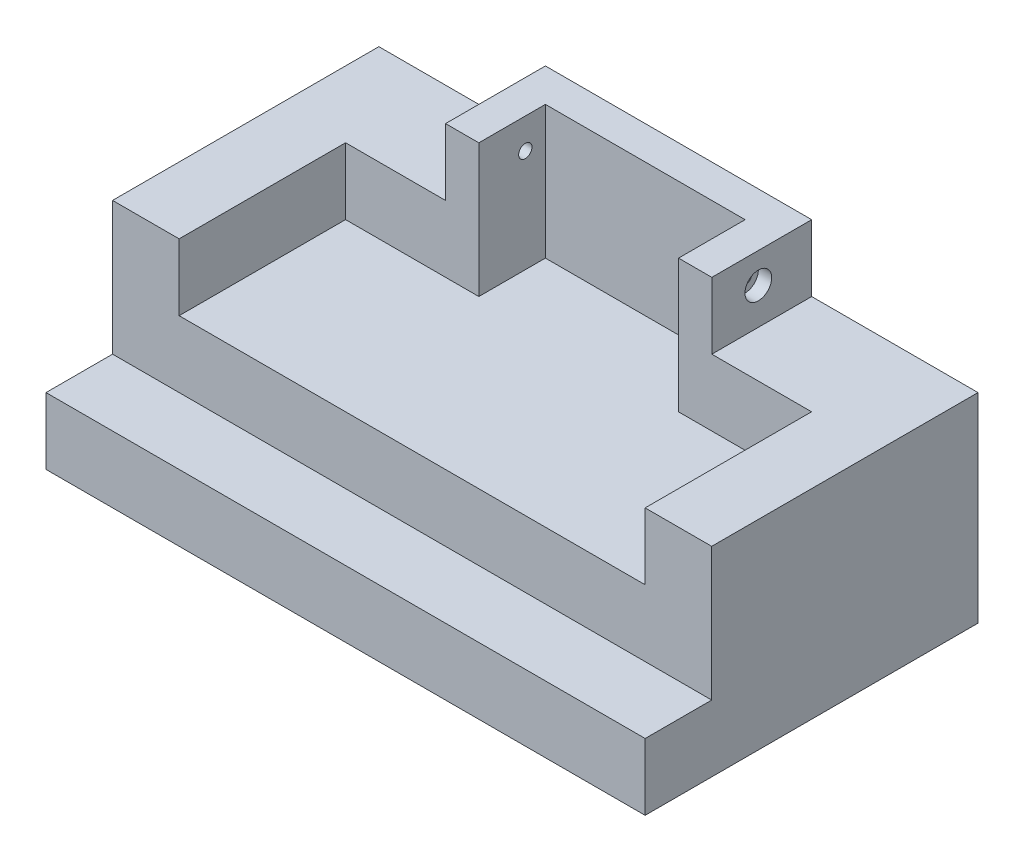
ISO-10303-21;
HEADER;
FILE_DESCRIPTION(('STEP AP214'),'2;1');
FILE_NAME('part.step','',(''),(''),'','','');
FILE_SCHEMA(('AUTOMOTIVE_DESIGN { 1 0 10303 214 1 1 1 1 }'));
ENDSEC;
DATA;
#1=APPLICATION_CONTEXT('core data for automotive mechanical design processes');
#2=APPLICATION_PROTOCOL_DEFINITION('international standard','automotive_design',2000,#1);
#3=PRODUCT_CONTEXT('',#1,'mechanical');
#4=PRODUCT('Part','Part','',(#3));
#5=PRODUCT_RELATED_PRODUCT_CATEGORY('part','',(#4));
#6=PRODUCT_DEFINITION_FORMATION('','',#4);
#7=PRODUCT_DEFINITION_CONTEXT('part definition',#1,'design');
#8=PRODUCT_DEFINITION('design','',#6,#7);
#9=PRODUCT_DEFINITION_SHAPE('','',#8);
#10=(LENGTH_UNIT() NAMED_UNIT(*) SI_UNIT(.MILLI.,.METRE.));
#11=(NAMED_UNIT(*) PLANE_ANGLE_UNIT() SI_UNIT($,.RADIAN.));
#12=(NAMED_UNIT(*) SI_UNIT($,.STERADIAN.) SOLID_ANGLE_UNIT());
#13=UNCERTAINTY_MEASURE_WITH_UNIT(LENGTH_MEASURE(1.E-05),#10,'distance_accuracy_value','');
#14=(GEOMETRIC_REPRESENTATION_CONTEXT(3) GLOBAL_UNCERTAINTY_ASSIGNED_CONTEXT((#13)) GLOBAL_UNIT_ASSIGNED_CONTEXT((#10,
#11,#12)) REPRESENTATION_CONTEXT('',''));
#15=CARTESIAN_POINT('',(0.,0.,0.));
#16=DIRECTION('',(0.,0.,1.));
#17=DIRECTION('',(1.,0.,0.));
#18=AXIS2_PLACEMENT_3D('',#15,#16,#17);
#19=CARTESIAN_POINT('',(1.25087486127139,1.5,0.));
#20=DIRECTION('',(-1.,0.,0.));
#21=DIRECTION('',(0.,0.,1.));
#22=AXIS2_PLACEMENT_3D('',#19,#20,#21);
#23=PLANE('',#22);
#24=DIRECTION('',(0.,0.,1.));
#25=VECTOR('',#24,1.);
#26=CARTESIAN_POINT('',(1.25087486127139,2.,0.));
#27=LINE('',#26,#25);
#28=CARTESIAN_POINT('',(1.25087486127139,2.,-2.5));
#29=VERTEX_POINT('',#28);
#30=CARTESIAN_POINT('',(1.25087486127139,2.,-1.75));
#31=VERTEX_POINT('',#30);
#32=EDGE_CURVE('E260',#29,#31,#27,.T.);
#33=ORIENTED_EDGE('',*,*,#32,.F.);
#34=DIRECTION('',(0.,1.,0.));
#35=VECTOR('',#34,1.);
#36=CARTESIAN_POINT('',(1.25087486127139,1.5,-2.5));
#37=LINE('',#36,#35);
#38=CARTESIAN_POINT('',(1.25087486127139,1.5,-2.5));
#39=VERTEX_POINT('',#38);
#40=EDGE_CURVE('E280',#39,#29,#37,.T.);
#41=ORIENTED_EDGE('',*,*,#40,.F.);
#42=DIRECTION('',(0.,0.,1.));
#43=VECTOR('',#42,1.);
#44=CARTESIAN_POINT('',(1.25087486127139,1.5,0.));
#45=LINE('',#44,#43);
#46=CARTESIAN_POINT('',(1.25087486127139,1.5,-1.75));
#47=VERTEX_POINT('',#46);
#48=EDGE_CURVE('E238',#39,#47,#45,.T.);
#49=ORIENTED_EDGE('',*,*,#48,.T.);
#50=DIRECTION('',(0.,1.,0.));
#51=VECTOR('',#50,1.);
#52=CARTESIAN_POINT('',(1.25087486127139,1.5,-1.75));
#53=LINE('',#52,#51);
#54=EDGE_CURVE('E283',#47,#31,#53,.T.);
#55=ORIENTED_EDGE('',*,*,#54,.T.);
#56=EDGE_LOOP('',(#33,#41,#49,#55));
#57=FACE_BOUND('',#56,.T.);
#58=CARTESIAN_POINT('',(1.25087486127139,1.77279252722854,-2.0992621020998));
#59=DIRECTION('',(-1.,0.,0.));
#60=DIRECTION('',(0.,0.,1.));
#61=AXIS2_PLACEMENT_3D('',#58,#59,#60);
#62=CIRCLE('',#61,0.0499999999999996);
#63=CARTESIAN_POINT('',(1.25087486127139,1.77279252722854,-2.0492621020998));
#64=VERTEX_POINT('',#63);
#65=EDGE_CURVE('E357',#64,#64,#62,.F.);
#66=ORIENTED_EDGE('',*,*,#65,.T.);
#67=EDGE_LOOP('',(#66));
#68=FACE_BOUND('',#67,.T.);
#69=ADVANCED_FACE('F42',(#57,#68),#23,.T.);
#70=CARTESIAN_POINT('',(0.,1.5,0.));
#71=DIRECTION('',(0.,1.,0.));
#72=DIRECTION('',(0.,0.,1.));
#73=AXIS2_PLACEMENT_3D('',#70,#71,#72);
#74=PLANE('',#73);
#75=DIRECTION('',(-1.,0.,0.));
#76=VECTOR('',#75,1.);
#77=CARTESIAN_POINT('',(0.5,1.5,-0.499892288813847));
#78=LINE('',#77,#76);
#79=CARTESIAN_POINT('',(4.5,1.5,-0.499892288813847));
#80=VERTEX_POINT('',#79);
#81=CARTESIAN_POINT('',(4.,1.5,-0.499892288813847));
#82=VERTEX_POINT('',#81);
#83=EDGE_CURVE('E178',#80,#82,#78,.T.);
#84=ORIENTED_EDGE('',*,*,#83,.F.);
#85=DIRECTION('',(0.,0.,-1.));
#86=VECTOR('',#85,1.);
#87=CARTESIAN_POINT('',(4.5,1.5,0.));
#88=LINE('',#87,#86);
#89=CARTESIAN_POINT('',(4.5,1.5,-2.5));
#90=VERTEX_POINT('',#89);
#91=EDGE_CURVE('E247',#80,#90,#88,.T.);
#92=ORIENTED_EDGE('',*,*,#91,.T.);
#93=DIRECTION('',(-1.,0.,0.));
#94=VECTOR('',#93,1.);
#95=CARTESIAN_POINT('',(0.,1.5,-2.5));
#96=LINE('',#95,#94);
#97=CARTESIAN_POINT('',(3.25087486127139,1.5,-2.5));
#98=VERTEX_POINT('',#97);
#99=EDGE_CURVE('E245',#90,#98,#96,.T.);
#100=ORIENTED_EDGE('',*,*,#99,.T.);
#101=DIRECTION('',(0.,0.,1.));
#102=VECTOR('',#101,1.);
#103=CARTESIAN_POINT('',(3.25087486127139,1.5,0.));
#104=LINE('',#103,#102);
#105=CARTESIAN_POINT('',(3.25087486127139,1.5,-1.75));
#106=VERTEX_POINT('',#105);
#107=EDGE_CURVE('E249',#98,#106,#104,.T.);
#108=ORIENTED_EDGE('',*,*,#107,.T.);
#109=DIRECTION('',(1.,0.,0.));
#110=VECTOR('',#109,1.);
#111=CARTESIAN_POINT('',(0.,1.5,-1.75));
#112=LINE('',#111,#110);
#113=CARTESIAN_POINT('',(4.,1.5,-1.75));
#114=VERTEX_POINT('',#113);
#115=EDGE_CURVE('E11',#106,#114,#112,.T.);
#116=ORIENTED_EDGE('',*,*,#115,.T.);
#117=DIRECTION('',(0.,0.,1.));
#118=VECTOR('',#117,1.);
#119=CARTESIAN_POINT('',(4.,1.5,0.));
#120=LINE('',#119,#118);
#121=EDGE_CURVE('E204',#114,#82,#120,.T.);
#122=ORIENTED_EDGE('',*,*,#121,.T.);
#123=EDGE_LOOP('',(#84,#92,#100,#108,#116,#122));
#124=FACE_BOUND('',#123,.T.);
#125=ADVANCED_FACE('F330',(#124),#74,.T.);
#126=CARTESIAN_POINT('',(0.,2.,0.));
#127=DIRECTION('',(0.,0.,-1.));
#128=DIRECTION('',(-1.,0.,0.));
#129=AXIS2_PLACEMENT_3D('',#126,#127,#128);
#130=PLANE('',#129);
#131=DIRECTION('',(1.,0.,0.));
#132=VECTOR('',#131,1.);
#133=CARTESIAN_POINT('',(0.,0.5,0.));
#134=LINE('',#133,#132);
#135=CARTESIAN_POINT('',(0.,0.5,0.));
#136=VERTEX_POINT('',#135);
#137=CARTESIAN_POINT('',(4.5,0.5,0.));
#138=VERTEX_POINT('',#137);
#139=EDGE_CURVE('E192',#136,#138,#134,.T.);
#140=ORIENTED_EDGE('',*,*,#139,.F.);
#141=DIRECTION('',(0.,-1.,0.));
#142=VECTOR('',#141,1.);
#143=CARTESIAN_POINT('',(0.,2.,0.));
#144=LINE('',#143,#142);
#145=CARTESIAN_POINT('',(0.,0.,0.));
#146=VERTEX_POINT('',#145);
#147=EDGE_CURVE('E51',#136,#146,#144,.T.);
#148=ORIENTED_EDGE('',*,*,#147,.T.);
#149=DIRECTION('',(1.,0.,0.));
#150=VECTOR('',#149,1.);
#151=CARTESIAN_POINT('',(0.,0.,0.));
#152=LINE('',#151,#150);
#153=CARTESIAN_POINT('',(4.5,0.,0.));
#154=VERTEX_POINT('',#153);
#155=EDGE_CURVE('E294',#146,#154,#152,.T.);
#156=ORIENTED_EDGE('',*,*,#155,.T.);
#157=DIRECTION('',(0.,-1.,0.));
#158=VECTOR('',#157,1.);
#159=CARTESIAN_POINT('',(4.5,2.,0.));
#160=LINE('',#159,#158);
#161=EDGE_CURVE('E305',#138,#154,#160,.T.);
#162=ORIENTED_EDGE('',*,*,#161,.F.);
#163=EDGE_LOOP('',(#140,#148,#156,#162));
#164=FACE_BOUND('',#163,.T.);
#165=ADVANCED_FACE('F309',(#164),#130,.F.);
#166=CARTESIAN_POINT('',(0.5,1.5,-0.499892288813847));
#167=VERTEX_POINT('',#166);
#168=CARTESIAN_POINT('',(0.,1.5,-0.499892288813847));
#169=VERTEX_POINT('',#168);
#170=EDGE_CURVE('E184',#167,#169,#78,.T.);
#171=ORIENTED_EDGE('',*,*,#170,.F.);
#172=DIRECTION('',(0.,0.,1.));
#173=VECTOR('',#172,1.);
#174=CARTESIAN_POINT('',(0.5,1.5,0.));
#175=LINE('',#174,#173);
#176=CARTESIAN_POINT('',(0.5,1.5,-1.75));
#177=VERTEX_POINT('',#176);
#178=EDGE_CURVE('E225',#177,#167,#175,.T.);
#179=ORIENTED_EDGE('',*,*,#178,.F.);
#180=DIRECTION('',(1.,0.,0.));
#181=VECTOR('',#180,1.);
#182=CARTESIAN_POINT('',(0.,1.5,-1.75));
#183=LINE('',#182,#181);
#184=EDGE_CURVE('E58',#177,#47,#183,.T.);
#185=ORIENTED_EDGE('',*,*,#184,.T.);
#186=ORIENTED_EDGE('',*,*,#48,.F.);
#187=CARTESIAN_POINT('',(0.,1.5,-2.5));
#188=VERTEX_POINT('',#187);
#189=EDGE_CURVE('E241',#39,#188,#96,.T.);
#190=ORIENTED_EDGE('',*,*,#189,.T.);
#191=DIRECTION('',(0.,0.,1.));
#192=VECTOR('',#191,1.);
#193=CARTESIAN_POINT('',(0.,1.5,0.));
#194=LINE('',#193,#192);
#195=EDGE_CURVE('E244',#188,#169,#194,.T.);
#196=ORIENTED_EDGE('',*,*,#195,.T.);
#197=EDGE_LOOP('',(#171,#179,#185,#186,#190,#196));
#198=FACE_BOUND('',#197,.T.);
#199=ADVANCED_FACE('F348',(#198),#74,.T.);
#200=CARTESIAN_POINT('',(0.,2.,0.));
#201=DIRECTION('',(1.,0.,0.));
#202=DIRECTION('',(0.,0.,-1.));
#203=AXIS2_PLACEMENT_3D('',#200,#201,#202);
#204=PLANE('',#203);
#205=DIRECTION('',(0.,0.,1.));
#206=VECTOR('',#205,1.);
#207=CARTESIAN_POINT('',(0.,0.5,-0.499892288813847));
#208=LINE('',#207,#206);
#209=CARTESIAN_POINT('',(0.,0.5,-0.499892288813847));
#210=VERTEX_POINT('',#209);
#211=EDGE_CURVE('E172',#210,#136,#208,.T.);
#212=ORIENTED_EDGE('',*,*,#211,.F.);
#213=DIRECTION('',(0.,1.,0.));
#214=VECTOR('',#213,1.);
#215=CARTESIAN_POINT('',(0.,0.5,-0.499892288813847));
#216=LINE('',#215,#214);
#217=EDGE_CURVE('E181',#210,#169,#216,.T.);
#218=ORIENTED_EDGE('',*,*,#217,.T.);
#219=ORIENTED_EDGE('',*,*,#195,.F.);
#220=DIRECTION('',(0.,-1.,0.));
#221=VECTOR('',#220,1.);
#222=CARTESIAN_POINT('',(0.,2.,-2.5));
#223=LINE('',#222,#221);
#224=CARTESIAN_POINT('',(0.,0.,-2.5));
#225=VERTEX_POINT('',#224);
#226=EDGE_CURVE('E291',#188,#225,#223,.T.);
#227=ORIENTED_EDGE('',*,*,#226,.T.);
#228=DIRECTION('',(0.,0.,1.));
#229=VECTOR('',#228,1.);
#230=CARTESIAN_POINT('',(0.,0.,0.));
#231=LINE('',#230,#229);
#232=EDGE_CURVE('E273',#225,#146,#231,.T.);
#233=ORIENTED_EDGE('',*,*,#232,.T.);
#234=ORIENTED_EDGE('',*,*,#147,.F.);
#235=EDGE_LOOP('',(#212,#218,#219,#227,#233,#234));
#236=FACE_BOUND('',#235,.T.);
#237=ADVANCED_FACE('F44',(#236),#204,.F.);
#238=CARTESIAN_POINT('',(4.5,2.,0.));
#239=DIRECTION('',(-1.,0.,0.));
#240=DIRECTION('',(0.,0.,1.));
#241=AXIS2_PLACEMENT_3D('',#238,#239,#240);
#242=PLANE('',#241);
#243=ORIENTED_EDGE('',*,*,#91,.F.);
#244=DIRECTION('',(0.,1.,0.));
#245=VECTOR('',#244,1.);
#246=CARTESIAN_POINT('',(4.5,0.5,-0.499892288813847));
#247=LINE('',#246,#245);
#248=CARTESIAN_POINT('',(4.5,0.5,-0.499892288813847));
#249=VERTEX_POINT('',#248);
#250=EDGE_CURVE('E188',#249,#80,#247,.T.);
#251=ORIENTED_EDGE('',*,*,#250,.F.);
#252=DIRECTION('',(0.,0.,-1.));
#253=VECTOR('',#252,1.);
#254=CARTESIAN_POINT('',(4.5,0.5,0.));
#255=LINE('',#254,#253);
#256=EDGE_CURVE('E175',#138,#249,#255,.T.);
#257=ORIENTED_EDGE('',*,*,#256,.F.);
#258=ORIENTED_EDGE('',*,*,#161,.T.);
#259=DIRECTION('',(0.,0.,-1.));
#260=VECTOR('',#259,1.);
#261=CARTESIAN_POINT('',(4.5,0.,0.));
#262=LINE('',#261,#260);
#263=CARTESIAN_POINT('',(4.5,0.,-2.5));
#264=VERTEX_POINT('',#263);
#265=EDGE_CURVE('E297',#154,#264,#262,.T.);
#266=ORIENTED_EDGE('',*,*,#265,.T.);
#267=DIRECTION('',(0.,-1.,0.));
#268=VECTOR('',#267,1.);
#269=CARTESIAN_POINT('',(4.5,2.,-2.5));
#270=LINE('',#269,#268);
#271=EDGE_CURVE('E303',#90,#264,#270,.T.);
#272=ORIENTED_EDGE('',*,*,#271,.F.);
#273=EDGE_LOOP('',(#243,#251,#257,#258,#266,#272));
#274=FACE_BOUND('',#273,.T.);
#275=ADVANCED_FACE('F327',(#274),#242,.F.);
#276=CARTESIAN_POINT('',(0.,2.,-2.5));
#277=DIRECTION('',(0.,0.,1.));
#278=DIRECTION('',(1.,0.,0.));
#279=AXIS2_PLACEMENT_3D('',#276,#277,#278);
#280=PLANE('',#279);
#281=DIRECTION('',(-1.,0.,0.));
#282=VECTOR('',#281,1.);
#283=CARTESIAN_POINT('',(0.,2.,-2.5));
#284=LINE('',#283,#282);
#285=CARTESIAN_POINT('',(3.25087486127139,2.,-2.5));
#286=VERTEX_POINT('',#285);
#287=EDGE_CURVE('E288',#286,#29,#284,.T.);
#288=ORIENTED_EDGE('',*,*,#287,.F.);
#289=DIRECTION('',(0.,1.,0.));
#290=VECTOR('',#289,1.);
#291=CARTESIAN_POINT('',(3.25087486127139,1.5,-2.5));
#292=LINE('',#291,#290);
#293=EDGE_CURVE('E278',#98,#286,#292,.T.);
#294=ORIENTED_EDGE('',*,*,#293,.F.);
#295=ORIENTED_EDGE('',*,*,#99,.F.);
#296=ORIENTED_EDGE('',*,*,#271,.T.);
#297=DIRECTION('',(-1.,0.,0.));
#298=VECTOR('',#297,1.);
#299=CARTESIAN_POINT('',(0.,0.,-2.5));
#300=LINE('',#299,#298);
#301=EDGE_CURVE('E292',#264,#225,#300,.T.);
#302=ORIENTED_EDGE('',*,*,#301,.T.);
#303=ORIENTED_EDGE('',*,*,#226,.F.);
#304=ORIENTED_EDGE('',*,*,#189,.F.);
#305=ORIENTED_EDGE('',*,*,#40,.T.);
#306=EDGE_LOOP('',(#288,#294,#295,#296,#302,#303,#304,#305));
#307=FACE_BOUND('',#306,.T.);
#308=ADVANCED_FACE('F320',(#307),#280,.F.);
#309=CARTESIAN_POINT('',(0.,2.,0.));
#310=DIRECTION('',(0.,-1.,0.));
#311=DIRECTION('',(0.,0.,-1.));
#312=AXIS2_PLACEMENT_3D('',#309,#310,#311);
#313=PLANE('',#312);
#314=DIRECTION('',(1.,0.,0.));
#315=VECTOR('',#314,1.);
#316=CARTESIAN_POINT('',(0.,2.,-1.75000000000001));
#317=LINE('',#316,#315);
#318=CARTESIAN_POINT('',(3.00087486127139,2.,-1.75));
#319=VERTEX_POINT('',#318);
#320=CARTESIAN_POINT('',(3.25087486127139,2.,-1.75));
#321=VERTEX_POINT('',#320);
#322=EDGE_CURVE('E266',#319,#321,#317,.T.);
#323=ORIENTED_EDGE('',*,*,#322,.T.);
#324=DIRECTION('',(0.,0.,1.));
#325=VECTOR('',#324,1.);
#326=CARTESIAN_POINT('',(3.25087486127139,2.,0.));
#327=LINE('',#326,#325);
#328=EDGE_CURVE('E263',#286,#321,#327,.T.);
#329=ORIENTED_EDGE('',*,*,#328,.F.);
#330=ORIENTED_EDGE('',*,*,#287,.T.);
#331=ORIENTED_EDGE('',*,*,#32,.T.);
#332=DIRECTION('',(1.,0.,0.));
#333=VECTOR('',#332,1.);
#334=CARTESIAN_POINT('',(0.,2.,-1.75));
#335=LINE('',#334,#333);
#336=CARTESIAN_POINT('',(1.50087486127139,2.,-1.75));
#337=VERTEX_POINT('',#336);
#338=EDGE_CURVE('E257',#31,#337,#335,.T.);
#339=ORIENTED_EDGE('',*,*,#338,.T.);
#340=DIRECTION('',(0.,0.,1.));
#341=VECTOR('',#340,1.);
#342=CARTESIAN_POINT('',(1.50087486127139,2.,0.));
#343=LINE('',#342,#341);
#344=CARTESIAN_POINT('',(1.50087486127139,2.,-2.25));
#345=VERTEX_POINT('',#344);
#346=EDGE_CURVE('E254',#345,#337,#343,.T.);
#347=ORIENTED_EDGE('',*,*,#346,.F.);
#348=DIRECTION('',(1.,0.,0.));
#349=VECTOR('',#348,1.);
#350=CARTESIAN_POINT('',(0.,2.,-2.25));
#351=LINE('',#350,#349);
#352=CARTESIAN_POINT('',(3.00087486127139,2.,-2.25));
#353=VERTEX_POINT('',#352);
#354=EDGE_CURVE('E66',#345,#353,#351,.T.);
#355=ORIENTED_EDGE('',*,*,#354,.T.);
#356=DIRECTION('',(0.,0.,1.));
#357=VECTOR('',#356,1.);
#358=CARTESIAN_POINT('',(3.00087486127139,2.,0.));
#359=LINE('',#358,#357);
#360=EDGE_CURVE('E242',#353,#319,#359,.T.);
#361=ORIENTED_EDGE('',*,*,#360,.T.);
#362=EDGE_LOOP('',(#323,#329,#330,#331,#339,#347,#355,#361));
#363=FACE_BOUND('',#362,.T.);
#364=ADVANCED_FACE('F392',(#363),#313,.F.);
#365=CARTESIAN_POINT('',(0.,0.,0.));
#366=DIRECTION('',(0.,-1.,0.));
#367=DIRECTION('',(0.,0.,-1.));
#368=AXIS2_PLACEMENT_3D('',#365,#366,#367);
#369=PLANE('',#368);
#370=ORIENTED_EDGE('',*,*,#232,.F.);
#371=ORIENTED_EDGE('',*,*,#301,.F.);
#372=ORIENTED_EDGE('',*,*,#265,.F.);
#373=ORIENTED_EDGE('',*,*,#155,.F.);
#374=EDGE_LOOP('',(#370,#371,#372,#373));
#375=FACE_BOUND('',#374,.T.);
#376=ADVANCED_FACE('F314',(#375),#369,.T.);
#377=CARTESIAN_POINT('',(0.,1.5,-2.25));
#378=DIRECTION('',(0.,0.,1.));
#379=DIRECTION('',(1.,0.,0.));
#380=AXIS2_PLACEMENT_3D('',#377,#378,#379);
#381=PLANE('',#380);
#382=ORIENTED_EDGE('',*,*,#354,.F.);
#383=DIRECTION('',(0.,1.,0.));
#384=VECTOR('',#383,1.);
#385=CARTESIAN_POINT('',(1.50087486127139,1.5,-2.25));
#386=LINE('',#385,#384);
#387=CARTESIAN_POINT('',(1.50087486127139,1.,-2.25));
#388=VERTEX_POINT('',#387);
#389=EDGE_CURVE('E252',#388,#345,#386,.T.);
#390=ORIENTED_EDGE('',*,*,#389,.F.);
#391=DIRECTION('',(-1.,0.,0.));
#392=VECTOR('',#391,1.);
#393=CARTESIAN_POINT('',(0.,1.,-2.25));
#394=LINE('',#393,#392);
#395=CARTESIAN_POINT('',(3.00087486127139,1.,-2.25));
#396=VERTEX_POINT('',#395);
#397=EDGE_CURVE('E217',#396,#388,#394,.T.);
#398=ORIENTED_EDGE('',*,*,#397,.F.);
#399=DIRECTION('',(0.,1.,0.));
#400=VECTOR('',#399,1.);
#401=CARTESIAN_POINT('',(3.00087486127139,1.5,-2.25));
#402=LINE('',#401,#400);
#403=EDGE_CURVE('E271',#396,#353,#402,.T.);
#404=ORIENTED_EDGE('',*,*,#403,.T.);
#405=EDGE_LOOP('',(#382,#390,#398,#404));
#406=FACE_BOUND('',#405,.T.);
#407=ADVANCED_FACE('F399',(#406),#381,.T.);
#408=CARTESIAN_POINT('',(3.00087486127139,1.5,0.));
#409=DIRECTION('',(-1.,0.,0.));
#410=DIRECTION('',(0.,0.,1.));
#411=AXIS2_PLACEMENT_3D('',#408,#409,#410);
#412=PLANE('',#411);
#413=CARTESIAN_POINT('',(3.00087486127139,1.77279252722854,-2.0992621020998));
#414=DIRECTION('',(-1.,0.,0.));
#415=DIRECTION('',(0.,0.,1.));
#416=AXIS2_PLACEMENT_3D('',#413,#414,#415);
#417=CIRCLE('',#416,0.0499999999999996);
#418=CARTESIAN_POINT('',(3.00087486127139,1.77279252722854,-2.0492621020998));
#419=VERTEX_POINT('',#418);
#420=EDGE_CURVE('E350',#419,#419,#417,.T.);
#421=ORIENTED_EDGE('',*,*,#420,.F.);
#422=EDGE_LOOP('',(#421));
#423=FACE_BOUND('',#422,.T.);
#424=ORIENTED_EDGE('',*,*,#360,.F.);
#425=ORIENTED_EDGE('',*,*,#403,.F.);
#426=DIRECTION('',(0.,0.,-1.));
#427=VECTOR('',#426,1.);
#428=CARTESIAN_POINT('',(3.00087486127139,1.,0.));
#429=LINE('',#428,#427);
#430=CARTESIAN_POINT('',(3.00087486127139,1.,-1.75));
#431=VERTEX_POINT('',#430);
#432=EDGE_CURVE('E214',#431,#396,#429,.T.);
#433=ORIENTED_EDGE('',*,*,#432,.F.);
#434=DIRECTION('',(0.,1.,0.));
#435=VECTOR('',#434,1.);
#436=CARTESIAN_POINT('',(3.00087486127139,1.5,-1.75));
#437=LINE('',#436,#435);
#438=EDGE_CURVE('E274',#431,#319,#437,.T.);
#439=ORIENTED_EDGE('',*,*,#438,.T.);
#440=EDGE_LOOP('',(#424,#425,#433,#439));
#441=FACE_BOUND('',#440,.T.);
#442=ADVANCED_FACE('F397',(#423,#441),#412,.T.);
#443=CARTESIAN_POINT('',(0.,1.5,-1.75000000000001));
#444=DIRECTION('',(0.,0.,1.));
#445=DIRECTION('',(1.,0.,0.));
#446=AXIS2_PLACEMENT_3D('',#443,#444,#445);
#447=PLANE('',#446);
#448=ORIENTED_EDGE('',*,*,#322,.F.);
#449=ORIENTED_EDGE('',*,*,#438,.F.);
#450=DIRECTION('',(1.,0.,0.));
#451=VECTOR('',#450,1.);
#452=CARTESIAN_POINT('',(0.,1.,-1.75));
#453=LINE('',#452,#451);
#454=CARTESIAN_POINT('',(4.,1.,-1.75));
#455=VERTEX_POINT('',#454);
#456=EDGE_CURVE('E205',#431,#455,#453,.T.);
#457=ORIENTED_EDGE('',*,*,#456,.T.);
#458=DIRECTION('',(0.,1.,0.));
#459=VECTOR('',#458,1.);
#460=CARTESIAN_POINT('',(4.,1.,-1.75));
#461=LINE('',#460,#459);
#462=EDGE_CURVE('E230',#455,#114,#461,.T.);
#463=ORIENTED_EDGE('',*,*,#462,.T.);
#464=ORIENTED_EDGE('',*,*,#115,.F.);
#465=DIRECTION('',(0.,1.,0.));
#466=VECTOR('',#465,1.);
#467=CARTESIAN_POINT('',(3.25087486127139,1.5,-1.75));
#468=LINE('',#467,#466);
#469=EDGE_CURVE('E276',#106,#321,#468,.T.);
#470=ORIENTED_EDGE('',*,*,#469,.T.);
#471=EDGE_LOOP('',(#448,#449,#457,#463,#464,#470));
#472=FACE_BOUND('',#471,.T.);
#473=ADVANCED_FACE('F386',(#472),#447,.T.);
#474=CARTESIAN_POINT('',(3.25087486127139,1.5,0.));
#475=DIRECTION('',(-1.,0.,0.));
#476=DIRECTION('',(0.,0.,1.));
#477=AXIS2_PLACEMENT_3D('',#474,#475,#476);
#478=PLANE('',#477);
#479=CARTESIAN_POINT('',(3.25087486127139,1.77279252722854,-2.0992621020998));
#480=DIRECTION('',(1.,0.,0.));
#481=DIRECTION('',(0.,0.,-1.));
#482=AXIS2_PLACEMENT_3D('',#479,#480,#481);
#483=CIRCLE('',#482,0.1);
#484=CARTESIAN_POINT('',(3.25087486127139,1.77279252722854,-2.1992621020998));
#485=VERTEX_POINT('',#484);
#486=EDGE_CURVE('E361',#485,#485,#483,.T.);
#487=ORIENTED_EDGE('',*,*,#486,.F.);
#488=EDGE_LOOP('',(#487));
#489=FACE_BOUND('',#488,.T.);
#490=ORIENTED_EDGE('',*,*,#328,.T.);
#491=ORIENTED_EDGE('',*,*,#469,.F.);
#492=ORIENTED_EDGE('',*,*,#107,.F.);
#493=ORIENTED_EDGE('',*,*,#293,.T.);
#494=EDGE_LOOP('',(#490,#491,#492,#493));
#495=FACE_BOUND('',#494,.T.);
#496=ADVANCED_FACE('F383',(#489,#495),#478,.F.);
#497=CARTESIAN_POINT('',(0.,1.5,-1.75));
#498=DIRECTION('',(0.,0.,1.));
#499=DIRECTION('',(1.,0.,0.));
#500=AXIS2_PLACEMENT_3D('',#497,#498,#499);
#501=PLANE('',#500);
#502=ORIENTED_EDGE('',*,*,#338,.F.);
#503=ORIENTED_EDGE('',*,*,#54,.F.);
#504=ORIENTED_EDGE('',*,*,#184,.F.);
#505=DIRECTION('',(0.,1.,0.));
#506=VECTOR('',#505,1.);
#507=CARTESIAN_POINT('',(0.5,1.,-1.75));
#508=LINE('',#507,#506);
#509=CARTESIAN_POINT('',(0.5,1.,-1.75));
#510=VERTEX_POINT('',#509);
#511=EDGE_CURVE('E223',#510,#177,#508,.T.);
#512=ORIENTED_EDGE('',*,*,#511,.F.);
#513=CARTESIAN_POINT('',(1.50087486127139,1.,-1.75));
#514=VERTEX_POINT('',#513);
#515=EDGE_CURVE('E200',#510,#514,#453,.T.);
#516=ORIENTED_EDGE('',*,*,#515,.T.);
#517=DIRECTION('',(0.,1.,0.));
#518=VECTOR('',#517,1.);
#519=CARTESIAN_POINT('',(1.50087486127139,1.5,-1.75));
#520=LINE('',#519,#518);
#521=EDGE_CURVE('E285',#514,#337,#520,.T.);
#522=ORIENTED_EDGE('',*,*,#521,.T.);
#523=EDGE_LOOP('',(#502,#503,#504,#512,#516,#522));
#524=FACE_BOUND('',#523,.T.);
#525=ADVANCED_FACE('F346',(#524),#501,.T.);
#526=CARTESIAN_POINT('',(1.50087486127139,1.5,0.));
#527=DIRECTION('',(-1.,0.,0.));
#528=DIRECTION('',(0.,0.,1.));
#529=AXIS2_PLACEMENT_3D('',#526,#527,#528);
#530=PLANE('',#529);
#531=CARTESIAN_POINT('',(1.50087486127139,1.77279252722854,-2.0992621020998));
#532=DIRECTION('',(-1.,0.,0.));
#533=DIRECTION('',(0.,0.,1.));
#534=AXIS2_PLACEMENT_3D('',#531,#532,#533);
#535=CIRCLE('',#534,0.0499999999999996);
#536=CARTESIAN_POINT('',(1.50087486127139,1.77279252722854,-2.0492621020998));
#537=VERTEX_POINT('',#536);
#538=EDGE_CURVE('E46',#537,#537,#535,.T.);
#539=ORIENTED_EDGE('',*,*,#538,.T.);
#540=EDGE_LOOP('',(#539));
#541=FACE_BOUND('',#540,.T.);
#542=ORIENTED_EDGE('',*,*,#346,.T.);
#543=ORIENTED_EDGE('',*,*,#521,.F.);
#544=DIRECTION('',(0.,0.,1.));
#545=VECTOR('',#544,1.);
#546=CARTESIAN_POINT('',(1.50087486127139,1.,0.));
#547=LINE('',#546,#545);
#548=EDGE_CURVE('E220',#388,#514,#547,.T.);
#549=ORIENTED_EDGE('',*,*,#548,.F.);
#550=ORIENTED_EDGE('',*,*,#389,.T.);
#551=EDGE_LOOP('',(#542,#543,#549,#550));
#552=FACE_BOUND('',#551,.T.);
#553=ADVANCED_FACE('F401',(#541,#552),#530,.F.);
#554=CARTESIAN_POINT('',(4.,1.,0.));
#555=DIRECTION('',(-1.,0.,0.));
#556=DIRECTION('',(0.,0.,1.));
#557=AXIS2_PLACEMENT_3D('',#554,#555,#556);
#558=PLANE('',#557);
#559=ORIENTED_EDGE('',*,*,#121,.F.);
#560=ORIENTED_EDGE('',*,*,#462,.F.);
#561=DIRECTION('',(0.,0.,1.));
#562=VECTOR('',#561,1.);
#563=CARTESIAN_POINT('',(4.,1.,0.));
#564=LINE('',#563,#562);
#565=CARTESIAN_POINT('',(4.,1.,-0.499892288813847));
#566=VERTEX_POINT('',#565);
#567=EDGE_CURVE('E211',#455,#566,#564,.T.);
#568=ORIENTED_EDGE('',*,*,#567,.T.);
#569=DIRECTION('',(0.,1.,0.));
#570=VECTOR('',#569,1.);
#571=CARTESIAN_POINT('',(4.,1.,-0.499892288813847));
#572=LINE('',#571,#570);
#573=EDGE_CURVE('E232',#566,#82,#572,.T.);
#574=ORIENTED_EDGE('',*,*,#573,.T.);
#575=EDGE_LOOP('',(#559,#560,#568,#574));
#576=FACE_BOUND('',#575,.T.);
#577=ADVANCED_FACE('F334',(#576),#558,.T.);
#578=CARTESIAN_POINT('',(0.5,1.,0.));
#579=DIRECTION('',(-1.,0.,0.));
#580=DIRECTION('',(0.,0.,1.));
#581=AXIS2_PLACEMENT_3D('',#578,#579,#580);
#582=PLANE('',#581);
#583=ORIENTED_EDGE('',*,*,#178,.T.);
#584=DIRECTION('',(0.,1.,0.));
#585=VECTOR('',#584,1.);
#586=CARTESIAN_POINT('',(0.5,1.,-0.499892288813847));
#587=LINE('',#586,#585);
#588=CARTESIAN_POINT('',(0.5,1.,-0.499892288813847));
#589=VERTEX_POINT('',#588);
#590=EDGE_CURVE('E235',#589,#167,#587,.T.);
#591=ORIENTED_EDGE('',*,*,#590,.F.);
#592=DIRECTION('',(0.,0.,1.));
#593=VECTOR('',#592,1.);
#594=CARTESIAN_POINT('',(0.5,1.,0.));
#595=LINE('',#594,#593);
#596=EDGE_CURVE('E203',#510,#589,#595,.T.);
#597=ORIENTED_EDGE('',*,*,#596,.F.);
#598=ORIENTED_EDGE('',*,*,#511,.T.);
#599=EDGE_LOOP('',(#583,#591,#597,#598));
#600=FACE_BOUND('',#599,.T.);
#601=ADVANCED_FACE('F340',(#600),#582,.F.);
#602=CARTESIAN_POINT('',(0.,1.,0.));
#603=DIRECTION('',(0.,1.,0.));
#604=DIRECTION('',(0.,0.,1.));
#605=AXIS2_PLACEMENT_3D('',#602,#603,#604);
#606=PLANE('',#605);
#607=ORIENTED_EDGE('',*,*,#515,.F.);
#608=ORIENTED_EDGE('',*,*,#596,.T.);
#609=DIRECTION('',(1.,0.,0.));
#610=VECTOR('',#609,1.);
#611=CARTESIAN_POINT('',(0.,1.,-0.499892288813847));
#612=LINE('',#611,#610);
#613=EDGE_CURVE('E208',#589,#566,#612,.T.);
#614=ORIENTED_EDGE('',*,*,#613,.T.);
#615=ORIENTED_EDGE('',*,*,#567,.F.);
#616=ORIENTED_EDGE('',*,*,#456,.F.);
#617=ORIENTED_EDGE('',*,*,#432,.T.);
#618=ORIENTED_EDGE('',*,*,#397,.T.);
#619=ORIENTED_EDGE('',*,*,#548,.T.);
#620=EDGE_LOOP('',(#607,#608,#614,#615,#616,#617,#618,#619));
#621=FACE_BOUND('',#620,.T.);
#622=ADVANCED_FACE('F343',(#621),#606,.T.);
#623=CARTESIAN_POINT('',(0.5,0.5,-0.499892288813847));
#624=DIRECTION('',(0.,0.,-1.));
#625=DIRECTION('',(-1.,0.,0.));
#626=AXIS2_PLACEMENT_3D('',#623,#624,#625);
#627=PLANE('',#626);
#628=ORIENTED_EDGE('',*,*,#573,.F.);
#629=ORIENTED_EDGE('',*,*,#613,.F.);
#630=ORIENTED_EDGE('',*,*,#590,.T.);
#631=ORIENTED_EDGE('',*,*,#170,.T.);
#632=ORIENTED_EDGE('',*,*,#217,.F.);
#633=DIRECTION('',(-1.,0.,0.));
#634=VECTOR('',#633,1.);
#635=CARTESIAN_POINT('',(4.5,0.5,-0.499892288813847));
#636=LINE('',#635,#634);
#637=EDGE_CURVE('E168',#249,#210,#636,.T.);
#638=ORIENTED_EDGE('',*,*,#637,.F.);
#639=ORIENTED_EDGE('',*,*,#250,.T.);
#640=ORIENTED_EDGE('',*,*,#83,.T.);
#641=EDGE_LOOP('',(#628,#629,#630,#631,#632,#638,#639,#640));
#642=FACE_BOUND('',#641,.T.);
#643=ADVANCED_FACE('F182',(#642),#627,.F.);
#644=CARTESIAN_POINT('',(0.,0.5,0.));
#645=DIRECTION('',(0.,1.,0.));
#646=DIRECTION('',(0.,0.,1.));
#647=AXIS2_PLACEMENT_3D('',#644,#645,#646);
#648=PLANE('',#647);
#649=ORIENTED_EDGE('',*,*,#637,.T.);
#650=ORIENTED_EDGE('',*,*,#211,.T.);
#651=ORIENTED_EDGE('',*,*,#139,.T.);
#652=ORIENTED_EDGE('',*,*,#256,.T.);
#653=EDGE_LOOP('',(#649,#650,#651,#652));
#654=FACE_BOUND('',#653,.T.);
#655=ADVANCED_FACE('F170',(#654),#648,.T.);
#656=CARTESIAN_POINT('',(3.25087486127139,1.77279252722854,-2.0992621020998));
#657=DIRECTION('',(1.,0.,0.));
#658=DIRECTION('',(0.,0.,-1.));
#659=AXIS2_PLACEMENT_3D('',#656,#657,#658);
#660=CYLINDRICAL_SURFACE('',#659,0.0499999999999996);
#661=ORIENTED_EDGE('',*,*,#65,.F.);
#662=EDGE_LOOP('',(#661));
#663=FACE_BOUND('',#662,.T.);
#664=ORIENTED_EDGE('',*,*,#538,.F.);
#665=EDGE_LOOP('',(#664));
#666=FACE_BOUND('',#665,.T.);
#667=ADVANCED_FACE('F409',(#663,#666),#660,.F.);
#668=ORIENTED_EDGE('',*,*,#420,.T.);
#669=EDGE_LOOP('',(#668));
#670=FACE_BOUND('',#669,.T.);
#671=CARTESIAN_POINT('',(3.15087486127139,1.77279252722854,-2.0992621020998));
#672=DIRECTION('',(1.,0.,0.));
#673=DIRECTION('',(0.,0.,-1.));
#674=AXIS2_PLACEMENT_3D('',#671,#672,#673);
#675=CIRCLE('',#674,0.0499999999999997);
#676=CARTESIAN_POINT('',(3.15087486127139,1.77279252722854,-2.1492621020998));
#677=VERTEX_POINT('',#676);
#678=EDGE_CURVE('E360',#677,#677,#675,.T.);
#679=ORIENTED_EDGE('',*,*,#678,.T.);
#680=EDGE_LOOP('',(#679));
#681=FACE_BOUND('',#680,.T.);
#682=ADVANCED_FACE('F369',(#670,#681),#660,.F.);
#683=CARTESIAN_POINT('',(3.15087486127139,1.82279252722853,-2.0992621020998));
#684=DIRECTION('',(-1.,0.,0.));
#685=DIRECTION('',(0.,0.,1.));
#686=AXIS2_PLACEMENT_3D('',#683,#684,#685);
#687=PLANE('',#686);
#688=ORIENTED_EDGE('',*,*,#678,.F.);
#689=EDGE_LOOP('',(#688));
#690=FACE_BOUND('',#689,.T.);
#691=CARTESIAN_POINT('',(3.15087486127139,1.77279252722854,-2.0992621020998));
#692=DIRECTION('',(1.,0.,0.));
#693=DIRECTION('',(0.,0.,-1.));
#694=AXIS2_PLACEMENT_3D('',#691,#692,#693);
#695=CIRCLE('',#694,0.1);
#696=CARTESIAN_POINT('',(3.15087486127139,1.77279252722854,-2.1992621020998));
#697=VERTEX_POINT('',#696);
#698=EDGE_CURVE('E355',#697,#697,#695,.T.);
#699=ORIENTED_EDGE('',*,*,#698,.T.);
#700=EDGE_LOOP('',(#699));
#701=FACE_BOUND('',#700,.T.);
#702=ADVANCED_FACE('F371',(#690,#701),#687,.F.);
#703=CARTESIAN_POINT('',(3.25087486127139,1.77279252722854,-2.0992621020998));
#704=DIRECTION('',(1.,0.,0.));
#705=DIRECTION('',(0.,0.,-1.));
#706=AXIS2_PLACEMENT_3D('',#703,#704,#705);
#707=CYLINDRICAL_SURFACE('',#706,0.1);
#708=ORIENTED_EDGE('',*,*,#698,.F.);
#709=EDGE_LOOP('',(#708));
#710=FACE_BOUND('',#709,.T.);
#711=ORIENTED_EDGE('',*,*,#486,.T.);
#712=EDGE_LOOP('',(#711));
#713=FACE_BOUND('',#712,.T.);
#714=ADVANCED_FACE('F374',(#710,#713),#707,.F.);
#715=CLOSED_SHELL('',(#69,#125,#165,#199,#237,#275,#308,#364,#376,#407,#442,#473,#496,#525,#553,
#577,#601,#622,#643,#655,#667,#682,#702,#714));
#716=MANIFOLD_SOLID_BREP('B2',#715);
#717=ADVANCED_BREP_SHAPE_REPRESENTATION('',(#18,#716),#14);
#718=SHAPE_DEFINITION_REPRESENTATION(#9,#717);
ENDSEC;
END-ISO-10303-21;
